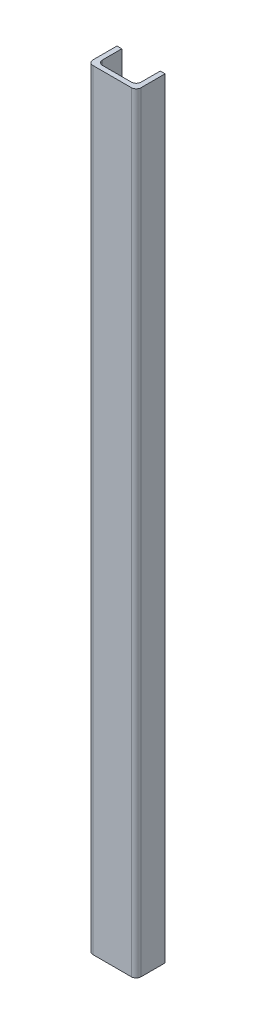
ISO-10303-21;
HEADER;
FILE_DESCRIPTION(('STEP AP214'),'2;1');
FILE_NAME('part.step','',(''),(''),'','','');
FILE_SCHEMA(('AUTOMOTIVE_DESIGN { 1 0 10303 214 1 1 1 1 }'));
ENDSEC;
DATA;
#1=APPLICATION_CONTEXT('core data for automotive mechanical design processes');
#2=APPLICATION_PROTOCOL_DEFINITION('international standard','automotive_design',2000,#1);
#3=PRODUCT_CONTEXT('',#1,'mechanical');
#4=PRODUCT('Part','Part','',(#3));
#5=PRODUCT_RELATED_PRODUCT_CATEGORY('part','',(#4));
#6=PRODUCT_DEFINITION_FORMATION('','',#4);
#7=PRODUCT_DEFINITION_CONTEXT('part definition',#1,'design');
#8=PRODUCT_DEFINITION('design','',#6,#7);
#9=PRODUCT_DEFINITION_SHAPE('','',#8);
#10=(LENGTH_UNIT() NAMED_UNIT(*) SI_UNIT(.MILLI.,.METRE.));
#11=(NAMED_UNIT(*) PLANE_ANGLE_UNIT() SI_UNIT($,.RADIAN.));
#12=(NAMED_UNIT(*) SI_UNIT($,.STERADIAN.) SOLID_ANGLE_UNIT());
#13=UNCERTAINTY_MEASURE_WITH_UNIT(LENGTH_MEASURE(1.E-05),#10,'distance_accuracy_value','');
#14=(GEOMETRIC_REPRESENTATION_CONTEXT(3) GLOBAL_UNCERTAINTY_ASSIGNED_CONTEXT((#13)) GLOBAL_UNIT_ASSIGNED_CONTEXT((#10,
#11,#12)) REPRESENTATION_CONTEXT('',''));
#15=CARTESIAN_POINT('',(0.,0.,0.));
#16=DIRECTION('',(0.,0.,1.));
#17=DIRECTION('',(1.,0.,0.));
#18=AXIS2_PLACEMENT_3D('',#15,#16,#17);
#19=CARTESIAN_POINT('',(20.,800.,-2.5));
#20=DIRECTION('',(0.,-1.,0.));
#21=DIRECTION('',(0.,0.,-1.));
#22=AXIS2_PLACEMENT_3D('',#19,#20,#21);
#23=CYLINDRICAL_SURFACE('',#22,5.);
#24=CARTESIAN_POINT('',(20.,0.,-2.5));
#25=DIRECTION('',(0.,1.,0.));
#26=DIRECTION('',(0.,0.,1.));
#27=AXIS2_PLACEMENT_3D('',#24,#25,#26);
#28=CIRCLE('',#27,5.);
#29=CARTESIAN_POINT('',(20.,0.,2.5));
#30=VERTEX_POINT('',#29);
#31=CARTESIAN_POINT('',(25.,0.,-2.50000000000004));
#32=VERTEX_POINT('',#31);
#33=EDGE_CURVE('E164',#30,#32,#28,.T.);
#34=ORIENTED_EDGE('',*,*,#33,.T.);
#35=DIRECTION('',(0.,-1.,0.));
#36=VECTOR('',#35,1.);
#37=CARTESIAN_POINT('',(25.,800.,-2.50000000000004));
#38=LINE('',#37,#36);
#39=CARTESIAN_POINT('',(25.,800.,-2.50000000000004));
#40=VERTEX_POINT('',#39);
#41=EDGE_CURVE('E11',#40,#32,#38,.T.);
#42=ORIENTED_EDGE('',*,*,#41,.F.);
#43=CARTESIAN_POINT('',(20.,800.,-2.5));
#44=DIRECTION('',(0.,1.,0.));
#45=DIRECTION('',(0.,0.,1.));
#46=AXIS2_PLACEMENT_3D('',#43,#44,#45);
#47=CIRCLE('',#46,5.);
#48=CARTESIAN_POINT('',(20.,800.,2.5));
#49=VERTEX_POINT('',#48);
#50=EDGE_CURVE('E198',#49,#40,#47,.T.);
#51=ORIENTED_EDGE('',*,*,#50,.F.);
#52=DIRECTION('',(0.,-1.,0.));
#53=VECTOR('',#52,1.);
#54=CARTESIAN_POINT('',(20.,800.,2.5));
#55=LINE('',#54,#53);
#56=EDGE_CURVE('E160',#49,#30,#55,.T.);
#57=ORIENTED_EDGE('',*,*,#56,.T.);
#58=EDGE_LOOP('',(#34,#42,#51,#57));
#59=FACE_BOUND('',#58,.T.);
#60=ADVANCED_FACE('F39',(#59),#23,.T.);
#61=CARTESIAN_POINT('',(25.,800.,-2.50000000000004));
#62=DIRECTION('',(-1.,0.,0.));
#63=DIRECTION('',(0.,0.,1.));
#64=AXIS2_PLACEMENT_3D('',#61,#62,#63);
#65=PLANE('',#64);
#66=DIRECTION('',(0.,0.,-1.));
#67=VECTOR('',#66,1.);
#68=CARTESIAN_POINT('',(25.,0.,-2.50000000000004));
#69=LINE('',#68,#67);
#70=CARTESIAN_POINT('',(25.,0.,-27.5));
#71=VERTEX_POINT('',#70);
#72=EDGE_CURVE('E168',#32,#71,#69,.T.);
#73=ORIENTED_EDGE('',*,*,#72,.T.);
#74=DIRECTION('',(0.,-1.,0.));
#75=VECTOR('',#74,1.);
#76=CARTESIAN_POINT('',(25.,800.,-27.5));
#77=LINE('',#76,#75);
#78=CARTESIAN_POINT('',(25.,800.,-27.5));
#79=VERTEX_POINT('',#78);
#80=EDGE_CURVE('E48',#79,#71,#77,.T.);
#81=ORIENTED_EDGE('',*,*,#80,.F.);
#82=DIRECTION('',(0.,0.,-1.));
#83=VECTOR('',#82,1.);
#84=CARTESIAN_POINT('',(25.,800.,-2.50000000000004));
#85=LINE('',#84,#83);
#86=EDGE_CURVE('E111',#40,#79,#85,.T.);
#87=ORIENTED_EDGE('',*,*,#86,.F.);
#88=ORIENTED_EDGE('',*,*,#41,.T.);
#89=EDGE_LOOP('',(#73,#81,#87,#88));
#90=FACE_BOUND('',#89,.T.);
#91=ADVANCED_FACE('F292',(#90),#65,.F.);
#92=CARTESIAN_POINT('',(25.,800.,-27.5));
#93=DIRECTION('',(0.,0.,1.));
#94=DIRECTION('',(1.,0.,0.));
#95=AXIS2_PLACEMENT_3D('',#92,#93,#94);
#96=PLANE('',#95);
#97=DIRECTION('',(-1.,0.,0.));
#98=VECTOR('',#97,1.);
#99=CARTESIAN_POINT('',(25.,0.,-27.5));
#100=LINE('',#99,#98);
#101=CARTESIAN_POINT('',(20.,0.,-27.5));
#102=VERTEX_POINT('',#101);
#103=EDGE_CURVE('E171',#71,#102,#100,.T.);
#104=ORIENTED_EDGE('',*,*,#103,.T.);
#105=DIRECTION('',(0.,-1.,0.));
#106=VECTOR('',#105,1.);
#107=CARTESIAN_POINT('',(20.,800.,-27.5));
#108=LINE('',#107,#106);
#109=CARTESIAN_POINT('',(20.,800.,-27.5));
#110=VERTEX_POINT('',#109);
#111=EDGE_CURVE('E225',#110,#102,#108,.T.);
#112=ORIENTED_EDGE('',*,*,#111,.F.);
#113=DIRECTION('',(-1.,0.,0.));
#114=VECTOR('',#113,1.);
#115=CARTESIAN_POINT('',(25.,800.,-27.5));
#116=LINE('',#115,#114);
#117=EDGE_CURVE('E235',#79,#110,#116,.T.);
#118=ORIENTED_EDGE('',*,*,#117,.F.);
#119=ORIENTED_EDGE('',*,*,#80,.T.);
#120=EDGE_LOOP('',(#104,#112,#118,#119));
#121=FACE_BOUND('',#120,.T.);
#122=ADVANCED_FACE('F233',(#121),#96,.F.);
#123=CARTESIAN_POINT('',(20.,800.,-7.50000000000003));
#124=DIRECTION('',(1.,0.,0.));
#125=DIRECTION('',(0.,0.,-1.));
#126=AXIS2_PLACEMENT_3D('',#123,#124,#125);
#127=PLANE('',#126);
#128=DIRECTION('',(0.,0.,1.));
#129=VECTOR('',#128,1.);
#130=CARTESIAN_POINT('',(20.,0.,-7.50000000000003));
#131=LINE('',#130,#129);
#132=CARTESIAN_POINT('',(20.,0.,-7.50000000000003));
#133=VERTEX_POINT('',#132);
#134=EDGE_CURVE('E174',#102,#133,#131,.T.);
#135=ORIENTED_EDGE('',*,*,#134,.T.);
#136=DIRECTION('',(0.,-1.,0.));
#137=VECTOR('',#136,1.);
#138=CARTESIAN_POINT('',(20.,800.,-7.50000000000003));
#139=LINE('',#138,#137);
#140=CARTESIAN_POINT('',(20.,800.,-7.50000000000003));
#141=VERTEX_POINT('',#140);
#142=EDGE_CURVE('E221',#141,#133,#139,.T.);
#143=ORIENTED_EDGE('',*,*,#142,.F.);
#144=DIRECTION('',(0.,0.,1.));
#145=VECTOR('',#144,1.);
#146=CARTESIAN_POINT('',(20.,800.,-7.50000000000003));
#147=LINE('',#146,#145);
#148=EDGE_CURVE('E254',#110,#141,#147,.T.);
#149=ORIENTED_EDGE('',*,*,#148,.F.);
#150=ORIENTED_EDGE('',*,*,#111,.T.);
#151=EDGE_LOOP('',(#135,#143,#149,#150));
#152=FACE_BOUND('',#151,.T.);
#153=ADVANCED_FACE('F244',(#152),#127,.F.);
#154=CARTESIAN_POINT('',(15.,800.,-7.5));
#155=DIRECTION('',(0.,-1.,0.));
#156=DIRECTION('',(0.,0.,-1.));
#157=AXIS2_PLACEMENT_3D('',#154,#155,#156);
#158=CYLINDRICAL_SURFACE('',#157,5.);
#159=CARTESIAN_POINT('',(15.,0.,-7.5));
#160=DIRECTION('',(0.,-1.,0.));
#161=DIRECTION('',(0.,0.,1.));
#162=AXIS2_PLACEMENT_3D('',#159,#160,#161);
#163=CIRCLE('',#162,5.);
#164=CARTESIAN_POINT('',(15.,0.,-2.5));
#165=VERTEX_POINT('',#164);
#166=EDGE_CURVE('E177',#133,#165,#163,.T.);
#167=ORIENTED_EDGE('',*,*,#166,.T.);
#168=DIRECTION('',(0.,-1.,0.));
#169=VECTOR('',#168,1.);
#170=CARTESIAN_POINT('',(15.,800.,-2.5));
#171=LINE('',#170,#169);
#172=CARTESIAN_POINT('',(15.,800.,-2.5));
#173=VERTEX_POINT('',#172);
#174=EDGE_CURVE('E217',#173,#165,#171,.T.);
#175=ORIENTED_EDGE('',*,*,#174,.F.);
#176=CARTESIAN_POINT('',(15.,800.,-7.5));
#177=DIRECTION('',(0.,-1.,0.));
#178=DIRECTION('',(0.,0.,1.));
#179=AXIS2_PLACEMENT_3D('',#176,#177,#178);
#180=CIRCLE('',#179,5.);
#181=EDGE_CURVE('E250',#141,#173,#180,.T.);
#182=ORIENTED_EDGE('',*,*,#181,.F.);
#183=ORIENTED_EDGE('',*,*,#142,.T.);
#184=EDGE_LOOP('',(#167,#175,#182,#183));
#185=FACE_BOUND('',#184,.T.);
#186=ADVANCED_FACE('F248',(#185),#158,.F.);
#187=CARTESIAN_POINT('',(-15.,800.,-2.5));
#188=DIRECTION('',(0.,0.,1.));
#189=DIRECTION('',(1.,0.,0.));
#190=AXIS2_PLACEMENT_3D('',#187,#188,#189);
#191=PLANE('',#190);
#192=DIRECTION('',(-1.,0.,0.));
#193=VECTOR('',#192,1.);
#194=CARTESIAN_POINT('',(-15.,0.,-2.5));
#195=LINE('',#194,#193);
#196=CARTESIAN_POINT('',(-15.,0.,-2.5));
#197=VERTEX_POINT('',#196);
#198=EDGE_CURVE('E180',#165,#197,#195,.T.);
#199=ORIENTED_EDGE('',*,*,#198,.T.);
#200=DIRECTION('',(0.,-1.,0.));
#201=VECTOR('',#200,1.);
#202=CARTESIAN_POINT('',(-15.,800.,-2.5));
#203=LINE('',#202,#201);
#204=CARTESIAN_POINT('',(-15.,800.,-2.5));
#205=VERTEX_POINT('',#204);
#206=EDGE_CURVE('E213',#205,#197,#203,.T.);
#207=ORIENTED_EDGE('',*,*,#206,.F.);
#208=DIRECTION('',(-1.,0.,0.));
#209=VECTOR('',#208,1.);
#210=CARTESIAN_POINT('',(-15.,800.,-2.5));
#211=LINE('',#210,#209);
#212=EDGE_CURVE('E253',#173,#205,#211,.T.);
#213=ORIENTED_EDGE('',*,*,#212,.F.);
#214=ORIENTED_EDGE('',*,*,#174,.T.);
#215=EDGE_LOOP('',(#199,#207,#213,#214));
#216=FACE_BOUND('',#215,.T.);
#217=ADVANCED_FACE('F305',(#216),#191,.F.);
#218=CARTESIAN_POINT('',(-15.,800.,-7.5));
#219=DIRECTION('',(0.,-1.,0.));
#220=DIRECTION('',(0.,0.,-1.));
#221=AXIS2_PLACEMENT_3D('',#218,#219,#220);
#222=CYLINDRICAL_SURFACE('',#221,5.);
#223=CARTESIAN_POINT('',(-15.,0.,-7.5));
#224=DIRECTION('',(0.,-1.,0.));
#225=DIRECTION('',(0.,0.,-1.));
#226=AXIS2_PLACEMENT_3D('',#223,#224,#225);
#227=CIRCLE('',#226,5.);
#228=CARTESIAN_POINT('',(-20.,0.,-7.50000000000003));
#229=VERTEX_POINT('',#228);
#230=EDGE_CURVE('E183',#197,#229,#227,.T.);
#231=ORIENTED_EDGE('',*,*,#230,.T.);
#232=DIRECTION('',(0.,-1.,0.));
#233=VECTOR('',#232,1.);
#234=CARTESIAN_POINT('',(-20.,800.,-7.50000000000003));
#235=LINE('',#234,#233);
#236=CARTESIAN_POINT('',(-20.,800.,-7.50000000000003));
#237=VERTEX_POINT('',#236);
#238=EDGE_CURVE('E209',#237,#229,#235,.T.);
#239=ORIENTED_EDGE('',*,*,#238,.F.);
#240=CARTESIAN_POINT('',(-15.,800.,-7.5));
#241=DIRECTION('',(0.,-1.,0.));
#242=DIRECTION('',(0.,0.,-1.));
#243=AXIS2_PLACEMENT_3D('',#240,#241,#242);
#244=CIRCLE('',#243,5.);
#245=EDGE_CURVE('E258',#205,#237,#244,.T.);
#246=ORIENTED_EDGE('',*,*,#245,.F.);
#247=ORIENTED_EDGE('',*,*,#206,.T.);
#248=EDGE_LOOP('',(#231,#239,#246,#247));
#249=FACE_BOUND('',#248,.T.);
#250=ADVANCED_FACE('F308',(#249),#222,.F.);
#251=CARTESIAN_POINT('',(-20.,800.,-27.5));
#252=DIRECTION('',(-1.,0.,0.));
#253=DIRECTION('',(0.,0.,1.));
#254=AXIS2_PLACEMENT_3D('',#251,#252,#253);
#255=PLANE('',#254);
#256=DIRECTION('',(0.,0.,-1.));
#257=VECTOR('',#256,1.);
#258=CARTESIAN_POINT('',(-20.,0.,-27.5));
#259=LINE('',#258,#257);
#260=CARTESIAN_POINT('',(-20.,0.,-27.5));
#261=VERTEX_POINT('',#260);
#262=EDGE_CURVE('E186',#229,#261,#259,.T.);
#263=ORIENTED_EDGE('',*,*,#262,.T.);
#264=DIRECTION('',(0.,-1.,0.));
#265=VECTOR('',#264,1.);
#266=CARTESIAN_POINT('',(-20.,800.,-27.5));
#267=LINE('',#266,#265);
#268=CARTESIAN_POINT('',(-20.,800.,-27.5));
#269=VERTEX_POINT('',#268);
#270=EDGE_CURVE('E205',#269,#261,#267,.T.);
#271=ORIENTED_EDGE('',*,*,#270,.F.);
#272=DIRECTION('',(0.,0.,-1.));
#273=VECTOR('',#272,1.);
#274=CARTESIAN_POINT('',(-20.,800.,-27.5));
#275=LINE('',#274,#273);
#276=EDGE_CURVE('E265',#237,#269,#275,.T.);
#277=ORIENTED_EDGE('',*,*,#276,.F.);
#278=ORIENTED_EDGE('',*,*,#238,.T.);
#279=EDGE_LOOP('',(#263,#271,#277,#278));
#280=FACE_BOUND('',#279,.T.);
#281=ADVANCED_FACE('F273',(#280),#255,.F.);
#282=CARTESIAN_POINT('',(-25.,800.,-27.5));
#283=DIRECTION('',(0.,0.,1.));
#284=DIRECTION('',(1.,0.,0.));
#285=AXIS2_PLACEMENT_3D('',#282,#283,#284);
#286=PLANE('',#285);
#287=DIRECTION('',(-1.,0.,0.));
#288=VECTOR('',#287,1.);
#289=CARTESIAN_POINT('',(-25.,0.,-27.5));
#290=LINE('',#289,#288);
#291=CARTESIAN_POINT('',(-25.,0.,-27.5));
#292=VERTEX_POINT('',#291);
#293=EDGE_CURVE('E189',#261,#292,#290,.T.);
#294=ORIENTED_EDGE('',*,*,#293,.T.);
#295=DIRECTION('',(0.,-1.,0.));
#296=VECTOR('',#295,1.);
#297=CARTESIAN_POINT('',(-25.,800.,-27.5));
#298=LINE('',#297,#296);
#299=CARTESIAN_POINT('',(-25.,800.,-27.5));
#300=VERTEX_POINT('',#299);
#301=EDGE_CURVE('E153',#300,#292,#298,.T.);
#302=ORIENTED_EDGE('',*,*,#301,.F.);
#303=DIRECTION('',(-1.,0.,0.));
#304=VECTOR('',#303,1.);
#305=CARTESIAN_POINT('',(-25.,800.,-27.5));
#306=LINE('',#305,#304);
#307=EDGE_CURVE('E142',#269,#300,#306,.T.);
#308=ORIENTED_EDGE('',*,*,#307,.F.);
#309=ORIENTED_EDGE('',*,*,#270,.T.);
#310=EDGE_LOOP('',(#294,#302,#308,#309));
#311=FACE_BOUND('',#310,.T.);
#312=ADVANCED_FACE('F277',(#311),#286,.F.);
#313=CARTESIAN_POINT('',(-25.,800.,-27.5));
#314=DIRECTION('',(1.,0.,0.));
#315=DIRECTION('',(0.,0.,-1.));
#316=AXIS2_PLACEMENT_3D('',#313,#314,#315);
#317=PLANE('',#316);
#318=DIRECTION('',(0.,0.,1.));
#319=VECTOR('',#318,1.);
#320=CARTESIAN_POINT('',(-25.,0.,-27.5));
#321=LINE('',#320,#319);
#322=CARTESIAN_POINT('',(-25.,0.,-2.50000000000004));
#323=VERTEX_POINT('',#322);
#324=EDGE_CURVE('E151',#292,#323,#321,.T.);
#325=ORIENTED_EDGE('',*,*,#324,.T.);
#326=DIRECTION('',(0.,-1.,0.));
#327=VECTOR('',#326,1.);
#328=CARTESIAN_POINT('',(-25.,800.,-2.50000000000004));
#329=LINE('',#328,#327);
#330=CARTESIAN_POINT('',(-25.,800.,-2.50000000000004));
#331=VERTEX_POINT('',#330);
#332=EDGE_CURVE('E148',#331,#323,#329,.T.);
#333=ORIENTED_EDGE('',*,*,#332,.F.);
#334=DIRECTION('',(0.,0.,1.));
#335=VECTOR('',#334,1.);
#336=CARTESIAN_POINT('',(-25.,800.,-27.5));
#337=LINE('',#336,#335);
#338=EDGE_CURVE('E136',#300,#331,#337,.T.);
#339=ORIENTED_EDGE('',*,*,#338,.F.);
#340=ORIENTED_EDGE('',*,*,#301,.T.);
#341=EDGE_LOOP('',(#325,#333,#339,#340));
#342=FACE_BOUND('',#341,.T.);
#343=ADVANCED_FACE('F149',(#342),#317,.F.);
#344=CARTESIAN_POINT('',(-20.,800.,-2.5));
#345=DIRECTION('',(0.,-1.,0.));
#346=DIRECTION('',(0.,0.,-1.));
#347=AXIS2_PLACEMENT_3D('',#344,#345,#346);
#348=CYLINDRICAL_SURFACE('',#347,5.);
#349=CARTESIAN_POINT('',(-20.,0.,-2.5));
#350=DIRECTION('',(0.,1.,0.));
#351=DIRECTION('',(0.,0.,1.));
#352=AXIS2_PLACEMENT_3D('',#349,#350,#351);
#353=CIRCLE('',#352,5.);
#354=CARTESIAN_POINT('',(-20.,0.,2.5));
#355=VERTEX_POINT('',#354);
#356=EDGE_CURVE('E97',#323,#355,#353,.T.);
#357=ORIENTED_EDGE('',*,*,#356,.T.);
#358=DIRECTION('',(0.,-1.,0.));
#359=VECTOR('',#358,1.);
#360=CARTESIAN_POINT('',(-20.,800.,2.5));
#361=LINE('',#360,#359);
#362=CARTESIAN_POINT('',(-20.,800.,2.5));
#363=VERTEX_POINT('',#362);
#364=EDGE_CURVE('E154',#363,#355,#361,.T.);
#365=ORIENTED_EDGE('',*,*,#364,.F.);
#366=CARTESIAN_POINT('',(-20.,800.,-2.5));
#367=DIRECTION('',(0.,1.,0.));
#368=DIRECTION('',(0.,0.,1.));
#369=AXIS2_PLACEMENT_3D('',#366,#367,#368);
#370=CIRCLE('',#369,5.);
#371=EDGE_CURVE('E140',#331,#363,#370,.T.);
#372=ORIENTED_EDGE('',*,*,#371,.F.);
#373=ORIENTED_EDGE('',*,*,#332,.T.);
#374=EDGE_LOOP('',(#357,#365,#372,#373));
#375=FACE_BOUND('',#374,.T.);
#376=ADVANCED_FACE('F156',(#375),#348,.T.);
#377=CARTESIAN_POINT('',(-20.,800.,2.5));
#378=DIRECTION('',(0.,0.,-1.));
#379=DIRECTION('',(-1.,0.,0.));
#380=AXIS2_PLACEMENT_3D('',#377,#378,#379);
#381=PLANE('',#380);
#382=DIRECTION('',(1.,0.,0.));
#383=VECTOR('',#382,1.);
#384=CARTESIAN_POINT('',(-20.,0.,2.5));
#385=LINE('',#384,#383);
#386=EDGE_CURVE('E103',#355,#30,#385,.T.);
#387=ORIENTED_EDGE('',*,*,#386,.T.);
#388=ORIENTED_EDGE('',*,*,#56,.F.);
#389=DIRECTION('',(1.,0.,0.));
#390=VECTOR('',#389,1.);
#391=CARTESIAN_POINT('',(-20.,800.,2.5));
#392=LINE('',#391,#390);
#393=EDGE_CURVE('E56',#363,#49,#392,.T.);
#394=ORIENTED_EDGE('',*,*,#393,.F.);
#395=ORIENTED_EDGE('',*,*,#364,.T.);
#396=EDGE_LOOP('',(#387,#388,#394,#395));
#397=FACE_BOUND('',#396,.T.);
#398=ADVANCED_FACE('F281',(#397),#381,.F.);
#399=CARTESIAN_POINT('',(20.,800.,-2.5));
#400=DIRECTION('',(0.,1.,0.));
#401=DIRECTION('',(0.,0.,1.));
#402=AXIS2_PLACEMENT_3D('',#399,#400,#401);
#403=PLANE('',#402);
#404=ORIENTED_EDGE('',*,*,#50,.T.);
#405=ORIENTED_EDGE('',*,*,#86,.T.);
#406=ORIENTED_EDGE('',*,*,#117,.T.);
#407=ORIENTED_EDGE('',*,*,#148,.T.);
#408=ORIENTED_EDGE('',*,*,#181,.T.);
#409=ORIENTED_EDGE('',*,*,#212,.T.);
#410=ORIENTED_EDGE('',*,*,#245,.T.);
#411=ORIENTED_EDGE('',*,*,#276,.T.);
#412=ORIENTED_EDGE('',*,*,#307,.T.);
#413=ORIENTED_EDGE('',*,*,#338,.T.);
#414=ORIENTED_EDGE('',*,*,#371,.T.);
#415=ORIENTED_EDGE('',*,*,#393,.T.);
#416=EDGE_LOOP('',(#404,#405,#406,#407,#408,#409,#410,#411,#412,#413,#414,#415));
#417=FACE_BOUND('',#416,.T.);
#418=ADVANCED_FACE('F138',(#417),#403,.T.);
#419=CARTESIAN_POINT('',(20.,0.,-2.5));
#420=DIRECTION('',(0.,1.,0.));
#421=DIRECTION('',(0.,0.,1.));
#422=AXIS2_PLACEMENT_3D('',#419,#420,#421);
#423=PLANE('',#422);
#424=ORIENTED_EDGE('',*,*,#33,.F.);
#425=ORIENTED_EDGE('',*,*,#386,.F.);
#426=ORIENTED_EDGE('',*,*,#356,.F.);
#427=ORIENTED_EDGE('',*,*,#324,.F.);
#428=ORIENTED_EDGE('',*,*,#293,.F.);
#429=ORIENTED_EDGE('',*,*,#262,.F.);
#430=ORIENTED_EDGE('',*,*,#230,.F.);
#431=ORIENTED_EDGE('',*,*,#198,.F.);
#432=ORIENTED_EDGE('',*,*,#166,.F.);
#433=ORIENTED_EDGE('',*,*,#134,.F.);
#434=ORIENTED_EDGE('',*,*,#103,.F.);
#435=ORIENTED_EDGE('',*,*,#72,.F.);
#436=EDGE_LOOP('',(#424,#425,#426,#427,#428,#429,#430,#431,#432,#433,#434,#435));
#437=FACE_BOUND('',#436,.T.);
#438=ADVANCED_FACE('F239',(#437),#423,.F.);
#439=CLOSED_SHELL('',(#60,#91,#122,#153,#186,#217,#250,#281,#312,#343,#376,#398,#418,#438));
#440=MANIFOLD_SOLID_BREP('B2',#439);
#441=ADVANCED_BREP_SHAPE_REPRESENTATION('',(#18,#440),#14);
#442=SHAPE_DEFINITION_REPRESENTATION(#9,#441);
ENDSEC;
END-ISO-10303-21;
